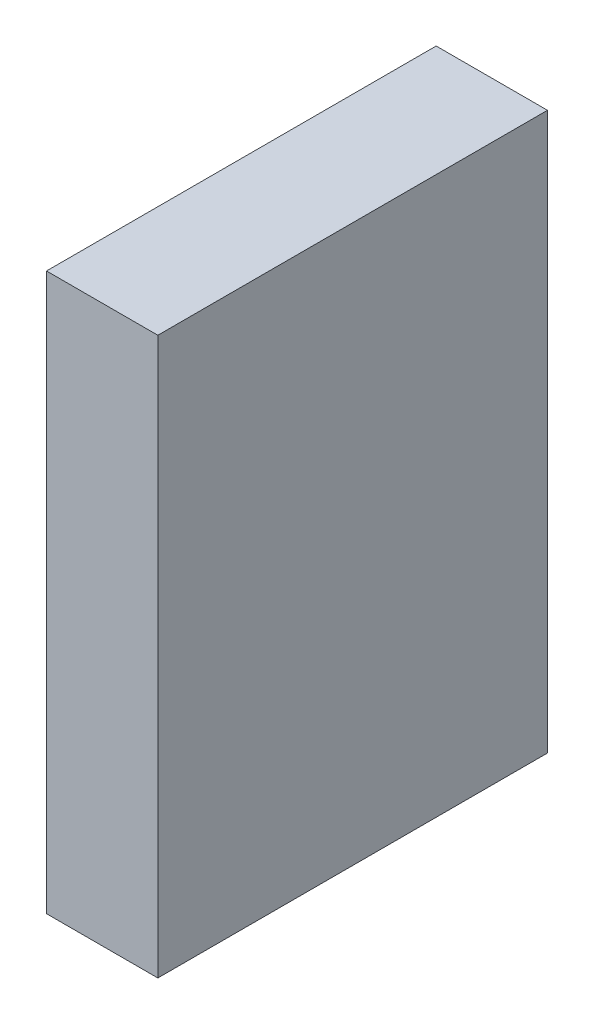
ISO-10303-21;
HEADER;
FILE_DESCRIPTION(('STEP AP214'),'2;1');
FILE_NAME('part.step','',(''),(''),'','','');
FILE_SCHEMA(('AUTOMOTIVE_DESIGN { 1 0 10303 214 1 1 1 1 }'));
ENDSEC;
DATA;
#1=APPLICATION_CONTEXT('core data for automotive mechanical design processes');
#2=APPLICATION_PROTOCOL_DEFINITION('international standard','automotive_design',2000,#1);
#3=PRODUCT_CONTEXT('',#1,'mechanical');
#4=PRODUCT('Part','Part','',(#3));
#5=PRODUCT_RELATED_PRODUCT_CATEGORY('part','',(#4));
#6=PRODUCT_DEFINITION_FORMATION('','',#4);
#7=PRODUCT_DEFINITION_CONTEXT('part definition',#1,'design');
#8=PRODUCT_DEFINITION('design','',#6,#7);
#9=PRODUCT_DEFINITION_SHAPE('','',#8);
#10=(LENGTH_UNIT() NAMED_UNIT(*) SI_UNIT(.MILLI.,.METRE.));
#11=(NAMED_UNIT(*) PLANE_ANGLE_UNIT() SI_UNIT($,.RADIAN.));
#12=(NAMED_UNIT(*) SI_UNIT($,.STERADIAN.) SOLID_ANGLE_UNIT());
#13=UNCERTAINTY_MEASURE_WITH_UNIT(LENGTH_MEASURE(1.E-05),#10,'distance_accuracy_value','');
#14=(GEOMETRIC_REPRESENTATION_CONTEXT(3) GLOBAL_UNCERTAINTY_ASSIGNED_CONTEXT((#13)) GLOBAL_UNIT_ASSIGNED_CONTEXT((#10,
#11,#12)) REPRESENTATION_CONTEXT('',''));
#15=CARTESIAN_POINT('',(0.,0.,0.));
#16=DIRECTION('',(0.,0.,1.));
#17=DIRECTION('',(1.,0.,0.));
#18=AXIS2_PLACEMENT_3D('',#15,#16,#17);
#19=CARTESIAN_POINT('',(0.4,-0.25,0.));
#20=DIRECTION('',(-1.,0.,0.));
#21=DIRECTION('',(0.,0.,1.));
#22=AXIS2_PLACEMENT_3D('',#19,#20,#21);
#23=PLANE('',#22);
#24=DIRECTION('',(0.,0.,1.));
#25=VECTOR('',#24,1.);
#26=CARTESIAN_POINT('',(0.4,0.25,0.));
#27=LINE('',#26,#25);
#28=CARTESIAN_POINT('',(0.4,0.25,0.));
#29=VERTEX_POINT('',#28);
#30=CARTESIAN_POINT('',(0.4,0.25,0.35));
#31=VERTEX_POINT('',#30);
#32=EDGE_CURVE('E20',#29,#31,#27,.T.);
#33=ORIENTED_EDGE('',*,*,#32,.F.);
#34=DIRECTION('',(0.,1.,0.));
#35=VECTOR('',#34,1.);
#36=CARTESIAN_POINT('',(0.4,0.,0.));
#37=LINE('',#36,#35);
#38=CARTESIAN_POINT('',(0.4,-0.25,0.));
#39=VERTEX_POINT('',#38);
#40=EDGE_CURVE('E79',#29,#39,#37,.F.);
#41=ORIENTED_EDGE('',*,*,#40,.T.);
#42=DIRECTION('',(0.,0.,-1.));
#43=VECTOR('',#42,1.);
#44=CARTESIAN_POINT('',(0.4,-0.25,0.));
#45=LINE('',#44,#43);
#46=CARTESIAN_POINT('',(0.4,-0.25,0.35));
#47=VERTEX_POINT('',#46);
#48=EDGE_CURVE('E61',#47,#39,#45,.T.);
#49=ORIENTED_EDGE('',*,*,#48,.F.);
#50=DIRECTION('',(0.,1.,0.));
#51=VECTOR('',#50,1.);
#52=CARTESIAN_POINT('',(0.4,0.,0.35));
#53=LINE('',#52,#51);
#54=EDGE_CURVE('E56',#31,#47,#53,.F.);
#55=ORIENTED_EDGE('',*,*,#54,.F.);
#56=EDGE_LOOP('',(#33,#41,#49,#55));
#57=FACE_BOUND('',#56,.T.);
#58=ADVANCED_FACE('F17',(#57),#23,.T.);
#59=CARTESIAN_POINT('',(0.4,0.25,0.));
#60=DIRECTION('',(0.,1.,0.));
#61=DIRECTION('',(0.,0.,1.));
#62=AXIS2_PLACEMENT_3D('',#59,#60,#61);
#63=PLANE('',#62);
#64=DIRECTION('',(0.,0.,-1.));
#65=VECTOR('',#64,1.);
#66=CARTESIAN_POINT('',(0.5,0.25,0.));
#67=LINE('',#66,#65);
#68=CARTESIAN_POINT('',(0.5,0.25,0.));
#69=VERTEX_POINT('',#68);
#70=CARTESIAN_POINT('',(0.5,0.25,0.35));
#71=VERTEX_POINT('',#70);
#72=EDGE_CURVE('E83',#69,#71,#67,.F.);
#73=ORIENTED_EDGE('',*,*,#72,.F.);
#74=DIRECTION('',(1.,0.,0.));
#75=VECTOR('',#74,1.);
#76=CARTESIAN_POINT('',(0.45,0.25,0.));
#77=LINE('',#76,#75);
#78=EDGE_CURVE('E68',#69,#29,#77,.F.);
#79=ORIENTED_EDGE('',*,*,#78,.T.);
#80=ORIENTED_EDGE('',*,*,#32,.T.);
#81=DIRECTION('',(1.,0.,0.));
#82=VECTOR('',#81,1.);
#83=CARTESIAN_POINT('',(0.45,0.25,0.35));
#84=LINE('',#83,#82);
#85=EDGE_CURVE('E63',#71,#31,#84,.F.);
#86=ORIENTED_EDGE('',*,*,#85,.F.);
#87=EDGE_LOOP('',(#73,#79,#80,#86));
#88=FACE_BOUND('',#87,.T.);
#89=ADVANCED_FACE('F65',(#88),#63,.T.);
#90=CARTESIAN_POINT('',(0.45,0.,0.35));
#91=DIRECTION('',(0.,0.,1.));
#92=DIRECTION('',(1.,0.,0.));
#93=AXIS2_PLACEMENT_3D('',#90,#91,#92);
#94=PLANE('',#93);
#95=DIRECTION('',(0.,1.,0.));
#96=VECTOR('',#95,1.);
#97=CARTESIAN_POINT('',(0.5,0.25,0.35));
#98=LINE('',#97,#96);
#99=CARTESIAN_POINT('',(0.5,-0.25,0.35));
#100=VERTEX_POINT('',#99);
#101=EDGE_CURVE('E72',#71,#100,#98,.F.);
#102=ORIENTED_EDGE('',*,*,#101,.F.);
#103=ORIENTED_EDGE('',*,*,#85,.T.);
#104=ORIENTED_EDGE('',*,*,#54,.T.);
#105=DIRECTION('',(1.,0.,0.));
#106=VECTOR('',#105,1.);
#107=CARTESIAN_POINT('',(0.5,-0.25,0.35));
#108=LINE('',#107,#106);
#109=EDGE_CURVE('E74',#100,#47,#108,.F.);
#110=ORIENTED_EDGE('',*,*,#109,.F.);
#111=EDGE_LOOP('',(#102,#103,#104,#110));
#112=FACE_BOUND('',#111,.T.);
#113=ADVANCED_FACE('F70',(#112),#94,.T.);
#114=CARTESIAN_POINT('',(0.5,-0.25,0.));
#115=DIRECTION('',(0.,-1.,0.));
#116=DIRECTION('',(0.,0.,-1.));
#117=AXIS2_PLACEMENT_3D('',#114,#115,#116);
#118=PLANE('',#117);
#119=ORIENTED_EDGE('',*,*,#48,.T.);
#120=DIRECTION('',(1.,0.,0.));
#121=VECTOR('',#120,1.);
#122=CARTESIAN_POINT('',(0.45,-0.25,0.));
#123=LINE('',#122,#121);
#124=CARTESIAN_POINT('',(0.5,-0.25,0.));
#125=VERTEX_POINT('',#124);
#126=EDGE_CURVE('E35',#39,#125,#123,.T.);
#127=ORIENTED_EDGE('',*,*,#126,.T.);
#128=DIRECTION('',(0.,0.,-1.));
#129=VECTOR('',#128,1.);
#130=CARTESIAN_POINT('',(0.5,-0.25,0.));
#131=LINE('',#130,#129);
#132=EDGE_CURVE('E26',#100,#125,#131,.T.);
#133=ORIENTED_EDGE('',*,*,#132,.F.);
#134=ORIENTED_EDGE('',*,*,#109,.T.);
#135=EDGE_LOOP('',(#119,#127,#133,#134));
#136=FACE_BOUND('',#135,.T.);
#137=ADVANCED_FACE('F89',(#136),#118,.T.);
#138=CARTESIAN_POINT('',(0.45,0.,0.));
#139=DIRECTION('',(0.,0.,1.));
#140=DIRECTION('',(1.,0.,0.));
#141=AXIS2_PLACEMENT_3D('',#138,#139,#140);
#142=PLANE('',#141);
#143=DIRECTION('',(0.,1.,0.));
#144=VECTOR('',#143,1.);
#145=CARTESIAN_POINT('',(0.5,0.25,0.));
#146=LINE('',#145,#144);
#147=EDGE_CURVE('E11',#125,#69,#146,.T.);
#148=ORIENTED_EDGE('',*,*,#147,.F.);
#149=ORIENTED_EDGE('',*,*,#126,.F.);
#150=ORIENTED_EDGE('',*,*,#40,.F.);
#151=ORIENTED_EDGE('',*,*,#78,.F.);
#152=EDGE_LOOP('',(#148,#149,#150,#151));
#153=FACE_BOUND('',#152,.T.);
#154=ADVANCED_FACE('F91',(#153),#142,.F.);
#155=CARTESIAN_POINT('',(0.5,0.25,0.));
#156=DIRECTION('',(1.,0.,0.));
#157=DIRECTION('',(0.,0.,-1.));
#158=AXIS2_PLACEMENT_3D('',#155,#156,#157);
#159=PLANE('',#158);
#160=ORIENTED_EDGE('',*,*,#132,.T.);
#161=ORIENTED_EDGE('',*,*,#147,.T.);
#162=ORIENTED_EDGE('',*,*,#72,.T.);
#163=ORIENTED_EDGE('',*,*,#101,.T.);
#164=EDGE_LOOP('',(#160,#161,#162,#163));
#165=FACE_BOUND('',#164,.T.);
#166=ADVANCED_FACE('F88',(#165),#159,.T.);
#167=CLOSED_SHELL('',(#58,#89,#113,#137,#154,#166));
#168=MANIFOLD_SOLID_BREP('B1',#167);
#169=ADVANCED_BREP_SHAPE_REPRESENTATION('',(#18,#168),#14);
#170=SHAPE_DEFINITION_REPRESENTATION(#9,#169);
ENDSEC;
END-ISO-10303-21;
